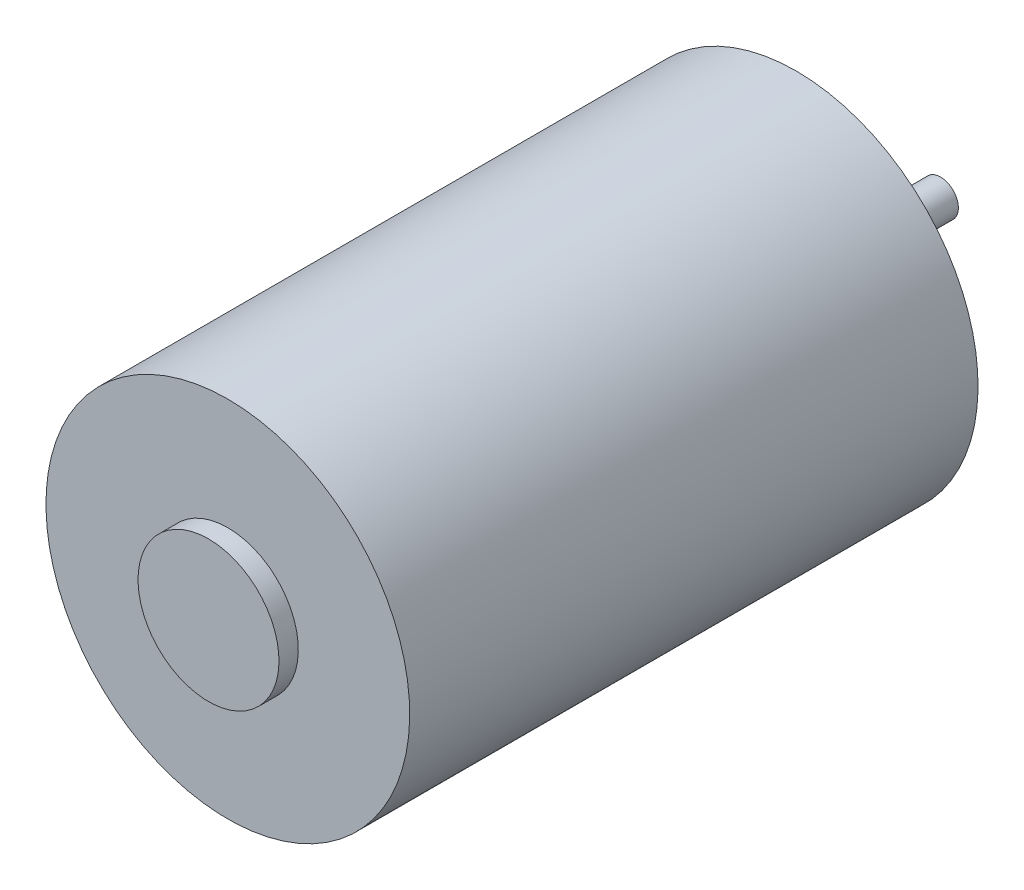
ISO-10303-21;
HEADER;
FILE_DESCRIPTION(('STEP AP214'),'2;1');
FILE_NAME('part.step','',(''),(''),'','','');
FILE_SCHEMA(('AUTOMOTIVE_DESIGN { 1 0 10303 214 1 1 1 1 }'));
ENDSEC;
DATA;
#1=APPLICATION_CONTEXT('core data for automotive mechanical design processes');
#2=APPLICATION_PROTOCOL_DEFINITION('international standard','automotive_design',2000,#1);
#3=PRODUCT_CONTEXT('',#1,'mechanical');
#4=PRODUCT('Part','Part','',(#3));
#5=PRODUCT_RELATED_PRODUCT_CATEGORY('part','',(#4));
#6=PRODUCT_DEFINITION_FORMATION('','',#4);
#7=PRODUCT_DEFINITION_CONTEXT('part definition',#1,'design');
#8=PRODUCT_DEFINITION('design','',#6,#7);
#9=PRODUCT_DEFINITION_SHAPE('','',#8);
#10=(LENGTH_UNIT() NAMED_UNIT(*) SI_UNIT(.MILLI.,.METRE.));
#11=(NAMED_UNIT(*) PLANE_ANGLE_UNIT() SI_UNIT($,.RADIAN.));
#12=(NAMED_UNIT(*) SI_UNIT($,.STERADIAN.) SOLID_ANGLE_UNIT());
#13=UNCERTAINTY_MEASURE_WITH_UNIT(LENGTH_MEASURE(1.E-05),#10,'distance_accuracy_value','');
#14=(GEOMETRIC_REPRESENTATION_CONTEXT(3) GLOBAL_UNCERTAINTY_ASSIGNED_CONTEXT((#13)) GLOBAL_UNIT_ASSIGNED_CONTEXT((#10,
#11,#12)) REPRESENTATION_CONTEXT('',''));
#15=CARTESIAN_POINT('',(0.,0.,0.));
#16=DIRECTION('',(0.,0.,1.));
#17=DIRECTION('',(1.,0.,0.));
#18=AXIS2_PLACEMENT_3D('',#15,#16,#17);
#19=CARTESIAN_POINT('',(0.,0.,0.));
#20=DIRECTION('',(0.,0.,-1.));
#21=DIRECTION('',(0.,1.,0.));
#22=AXIS2_PLACEMENT_3D('',#19,#20,#21);
#23=PLANE('',#22);
#24=CARTESIAN_POINT('',(0.,0.,0.));
#25=DIRECTION('',(0.,0.,-1.));
#26=DIRECTION('',(0.,1.,0.));
#27=AXIS2_PLACEMENT_3D('',#24,#25,#26);
#28=CIRCLE('',#27,6.20000000000001);
#29=CARTESIAN_POINT('',(0.,6.20000000000001,0.));
#30=VERTEX_POINT('',#29);
#31=EDGE_CURVE('E10',#30,#30,#28,.T.);
#32=ORIENTED_EDGE('',*,*,#31,.F.);
#33=EDGE_LOOP('',(#32));
#34=FACE_BOUND('',#33,.T.);
#35=ADVANCED_FACE('F29',(#34),#23,.F.);
#36=CARTESIAN_POINT('',(0.,0.,-64.4));
#37=DIRECTION('',(0.,0.,-1.));
#38=DIRECTION('',(0.,1.,0.));
#39=AXIS2_PLACEMENT_3D('',#36,#37,#38);
#40=CYLINDRICAL_SURFACE('',#39,6.2);
#41=CARTESIAN_POINT('',(0.,0.,-1.70000000000001));
#42=DIRECTION('',(0.,0.,-1.));
#43=DIRECTION('',(0.,1.,0.));
#44=AXIS2_PLACEMENT_3D('',#41,#42,#43);
#45=CIRCLE('',#44,6.2);
#46=CARTESIAN_POINT('',(0.,6.2,-1.70000000000001));
#47=VERTEX_POINT('',#46);
#48=EDGE_CURVE('E35',#47,#47,#45,.T.);
#49=ORIENTED_EDGE('',*,*,#48,.F.);
#50=EDGE_LOOP('',(#49));
#51=FACE_BOUND('',#50,.T.);
#52=ORIENTED_EDGE('',*,*,#31,.T.);
#53=EDGE_LOOP('',(#52));
#54=FACE_BOUND('',#53,.T.);
#55=ADVANCED_FACE('F101',(#51,#54),#40,.T.);
#56=CARTESIAN_POINT('',(0.,-6.2,-1.7));
#57=DIRECTION('',(0.,0.,-1.));
#58=DIRECTION('',(0.,1.,0.));
#59=AXIS2_PLACEMENT_3D('',#56,#57,#58);
#60=PLANE('',#59);
#61=CARTESIAN_POINT('',(0.,0.,-1.70000000000001));
#62=DIRECTION('',(0.,0.,-1.));
#63=DIRECTION('',(0.,1.,0.));
#64=AXIS2_PLACEMENT_3D('',#61,#62,#63);
#65=CIRCLE('',#64,16.);
#66=CARTESIAN_POINT('',(0.,16.,-1.70000000000001));
#67=VERTEX_POINT('',#66);
#68=EDGE_CURVE('E39',#67,#67,#65,.T.);
#69=ORIENTED_EDGE('',*,*,#68,.F.);
#70=EDGE_LOOP('',(#69));
#71=FACE_BOUND('',#70,.T.);
#72=ORIENTED_EDGE('',*,*,#48,.T.);
#73=EDGE_LOOP('',(#72));
#74=FACE_BOUND('',#73,.T.);
#75=ADVANCED_FACE('F96',(#71,#74),#60,.F.);
#76=CARTESIAN_POINT('',(0.,0.,-64.4));
#77=DIRECTION('',(0.,0.,-1.));
#78=DIRECTION('',(0.,1.,0.));
#79=AXIS2_PLACEMENT_3D('',#76,#77,#78);
#80=CYLINDRICAL_SURFACE('',#79,16.);
#81=CARTESIAN_POINT('',(0.,0.,-51.7));
#82=DIRECTION('',(0.,0.,-1.));
#83=DIRECTION('',(0.,1.,0.));
#84=AXIS2_PLACEMENT_3D('',#81,#82,#83);
#85=CIRCLE('',#84,16.);
#86=CARTESIAN_POINT('',(0.,16.,-51.7));
#87=VERTEX_POINT('',#86);
#88=EDGE_CURVE('E43',#87,#87,#85,.T.);
#89=ORIENTED_EDGE('',*,*,#88,.F.);
#90=EDGE_LOOP('',(#89));
#91=FACE_BOUND('',#90,.T.);
#92=ORIENTED_EDGE('',*,*,#68,.T.);
#93=EDGE_LOOP('',(#92));
#94=FACE_BOUND('',#93,.T.);
#95=ADVANCED_FACE('F86',(#91,#94),#80,.T.);
#96=CARTESIAN_POINT('',(0.,-6.19999999999999,-51.7));
#97=DIRECTION('',(0.,0.,1.));
#98=DIRECTION('',(0.,-1.,0.));
#99=AXIS2_PLACEMENT_3D('',#96,#97,#98);
#100=PLANE('',#99);
#101=CARTESIAN_POINT('',(12.7,0.,-51.7));
#102=DIRECTION('',(0.,0.,-1.));
#103=DIRECTION('',(0.,1.,0.));
#104=AXIS2_PLACEMENT_3D('',#101,#102,#103);
#105=CIRCLE('',#104,2.);
#106=CARTESIAN_POINT('',(12.7,2.,-51.7));
#107=VERTEX_POINT('',#106);
#108=EDGE_CURVE('E67',#107,#107,#105,.T.);
#109=ORIENTED_EDGE('',*,*,#108,.F.);
#110=EDGE_LOOP('',(#109));
#111=FACE_BOUND('',#110,.T.);
#112=CARTESIAN_POINT('',(-12.7,0.,-51.7));
#113=DIRECTION('',(0.,0.,-1.));
#114=DIRECTION('',(0.,1.,0.));
#115=AXIS2_PLACEMENT_3D('',#112,#113,#114);
#116=CIRCLE('',#115,2.);
#117=CARTESIAN_POINT('',(-12.7,2.,-51.7));
#118=VERTEX_POINT('',#117);
#119=EDGE_CURVE('E61',#118,#118,#116,.T.);
#120=ORIENTED_EDGE('',*,*,#119,.F.);
#121=EDGE_LOOP('',(#120));
#122=FACE_BOUND('',#121,.T.);
#123=CARTESIAN_POINT('',(0.,0.,-51.7));
#124=DIRECTION('',(0.,0.,-1.));
#125=DIRECTION('',(0.,1.,0.));
#126=AXIS2_PLACEMENT_3D('',#123,#124,#125);
#127=CIRCLE('',#126,6.19999999999999);
#128=CARTESIAN_POINT('',(0.,6.19999999999999,-51.7));
#129=VERTEX_POINT('',#128);
#130=EDGE_CURVE('E48',#129,#129,#127,.T.);
#131=ORIENTED_EDGE('',*,*,#130,.F.);
#132=EDGE_LOOP('',(#131));
#133=FACE_BOUND('',#132,.T.);
#134=ORIENTED_EDGE('',*,*,#88,.T.);
#135=EDGE_LOOP('',(#134));
#136=FACE_BOUND('',#135,.T.);
#137=ADVANCED_FACE('F82',(#111,#122,#133,#136),#100,.F.);
#138=CARTESIAN_POINT('',(0.,0.,-64.4));
#139=DIRECTION('',(0.,0.,-1.));
#140=DIRECTION('',(0.,1.,0.));
#141=AXIS2_PLACEMENT_3D('',#138,#139,#140);
#142=CYLINDRICAL_SURFACE('',#141,6.19999999999999);
#143=CARTESIAN_POINT('',(0.,0.,-53.4));
#144=DIRECTION('',(0.,0.,-1.));
#145=DIRECTION('',(0.,1.,0.));
#146=AXIS2_PLACEMENT_3D('',#143,#144,#145);
#147=CIRCLE('',#146,6.19999999999999);
#148=CARTESIAN_POINT('',(0.,6.19999999999999,-53.4));
#149=VERTEX_POINT('',#148);
#150=EDGE_CURVE('E51',#149,#149,#147,.T.);
#151=ORIENTED_EDGE('',*,*,#150,.F.);
#152=EDGE_LOOP('',(#151));
#153=FACE_BOUND('',#152,.T.);
#154=ORIENTED_EDGE('',*,*,#130,.T.);
#155=EDGE_LOOP('',(#154));
#156=FACE_BOUND('',#155,.T.);
#157=ADVANCED_FACE('F85',(#153,#156),#142,.T.);
#158=CARTESIAN_POINT('',(0.,-1.57,-53.4));
#159=DIRECTION('',(0.,0.,1.));
#160=DIRECTION('',(0.,-1.,0.));
#161=AXIS2_PLACEMENT_3D('',#158,#159,#160);
#162=PLANE('',#161);
#163=CARTESIAN_POINT('',(0.,0.,-53.4));
#164=DIRECTION('',(0.,0.,-1.));
#165=DIRECTION('',(0.,1.,0.));
#166=AXIS2_PLACEMENT_3D('',#163,#164,#165);
#167=CIRCLE('',#166,1.57);
#168=CARTESIAN_POINT('',(0.,1.57,-53.4));
#169=VERTEX_POINT('',#168);
#170=EDGE_CURVE('E54',#169,#169,#167,.T.);
#171=ORIENTED_EDGE('',*,*,#170,.F.);
#172=EDGE_LOOP('',(#171));
#173=FACE_BOUND('',#172,.T.);
#174=ORIENTED_EDGE('',*,*,#150,.T.);
#175=EDGE_LOOP('',(#174));
#176=FACE_BOUND('',#175,.T.);
#177=ADVANCED_FACE('F136',(#173,#176),#162,.F.);
#178=CARTESIAN_POINT('',(0.,0.,-64.4));
#179=DIRECTION('',(0.,0.,-1.));
#180=DIRECTION('',(0.,1.,0.));
#181=AXIS2_PLACEMENT_3D('',#178,#179,#180);
#182=CYLINDRICAL_SURFACE('',#181,1.57);
#183=CARTESIAN_POINT('',(0.,0.,-64.4));
#184=DIRECTION('',(0.,0.,-1.));
#185=DIRECTION('',(0.,1.,0.));
#186=AXIS2_PLACEMENT_3D('',#183,#184,#185);
#187=CIRCLE('',#186,1.57);
#188=CARTESIAN_POINT('',(0.,1.57,-64.4));
#189=VERTEX_POINT('',#188);
#190=EDGE_CURVE('E57',#189,#189,#187,.T.);
#191=ORIENTED_EDGE('',*,*,#190,.F.);
#192=EDGE_LOOP('',(#191));
#193=FACE_BOUND('',#192,.T.);
#194=ORIENTED_EDGE('',*,*,#170,.T.);
#195=EDGE_LOOP('',(#194));
#196=FACE_BOUND('',#195,.T.);
#197=ADVANCED_FACE('F146',(#193,#196),#182,.T.);
#198=CARTESIAN_POINT('',(0.,-1.57,-64.4));
#199=DIRECTION('',(0.,0.,1.));
#200=DIRECTION('',(0.,-1.,0.));
#201=AXIS2_PLACEMENT_3D('',#198,#199,#200);
#202=PLANE('',#201);
#203=ORIENTED_EDGE('',*,*,#190,.T.);
#204=EDGE_LOOP('',(#203));
#205=FACE_BOUND('',#204,.T.);
#206=ADVANCED_FACE('F156',(#205),#202,.F.);
#207=CARTESIAN_POINT('',(-12.7,0.,-41.7));
#208=DIRECTION('',(0.,0.,-1.));
#209=DIRECTION('',(0.,1.,0.));
#210=AXIS2_PLACEMENT_3D('',#207,#208,#209);
#211=CYLINDRICAL_SURFACE('',#210,2.);
#212=CARTESIAN_POINT('',(-12.7,0.,-41.7));
#213=DIRECTION('',(0.,0.,-1.));
#214=DIRECTION('',(0.,1.,0.));
#215=AXIS2_PLACEMENT_3D('',#212,#213,#214);
#216=CIRCLE('',#215,2.);
#217=CARTESIAN_POINT('',(-12.7,2.,-41.7));
#218=VERTEX_POINT('',#217);
#219=EDGE_CURVE('E60',#218,#218,#216,.T.);
#220=ORIENTED_EDGE('',*,*,#219,.F.);
#221=EDGE_LOOP('',(#220));
#222=FACE_BOUND('',#221,.T.);
#223=ORIENTED_EDGE('',*,*,#119,.T.);
#224=EDGE_LOOP('',(#223));
#225=FACE_BOUND('',#224,.T.);
#226=ADVANCED_FACE('F165',(#222,#225),#211,.F.);
#227=CARTESIAN_POINT('',(-12.7,0.,-41.7));
#228=DIRECTION('',(0.,0.,-1.));
#229=DIRECTION('',(0.,1.,0.));
#230=AXIS2_PLACEMENT_3D('',#227,#228,#229);
#231=PLANE('',#230);
#232=ORIENTED_EDGE('',*,*,#219,.T.);
#233=EDGE_LOOP('',(#232));
#234=FACE_BOUND('',#233,.T.);
#235=ADVANCED_FACE('F78',(#234),#231,.T.);
#236=CARTESIAN_POINT('',(12.7,0.,-41.7));
#237=DIRECTION('',(0.,0.,-1.));
#238=DIRECTION('',(0.,1.,0.));
#239=AXIS2_PLACEMENT_3D('',#236,#237,#238);
#240=CYLINDRICAL_SURFACE('',#239,2.);
#241=CARTESIAN_POINT('',(12.7,0.,-41.7));
#242=DIRECTION('',(0.,0.,-1.));
#243=DIRECTION('',(0.,1.,0.));
#244=AXIS2_PLACEMENT_3D('',#241,#242,#243);
#245=CIRCLE('',#244,2.);
#246=CARTESIAN_POINT('',(12.7,2.,-41.7));
#247=VERTEX_POINT('',#246);
#248=EDGE_CURVE('E64',#247,#247,#245,.T.);
#249=ORIENTED_EDGE('',*,*,#248,.F.);
#250=EDGE_LOOP('',(#249));
#251=FACE_BOUND('',#250,.T.);
#252=ORIENTED_EDGE('',*,*,#108,.T.);
#253=EDGE_LOOP('',(#252));
#254=FACE_BOUND('',#253,.T.);
#255=ADVANCED_FACE('F75',(#251,#254),#240,.F.);
#256=CARTESIAN_POINT('',(12.7,0.,-41.7));
#257=DIRECTION('',(0.,0.,-1.));
#258=DIRECTION('',(0.,1.,0.));
#259=AXIS2_PLACEMENT_3D('',#256,#257,#258);
#260=PLANE('',#259);
#261=ORIENTED_EDGE('',*,*,#248,.T.);
#262=EDGE_LOOP('',(#261));
#263=FACE_BOUND('',#262,.T.);
#264=ADVANCED_FACE('F73',(#263),#260,.T.);
#265=CLOSED_SHELL('',(#35,#55,#75,#95,#137,#157,#177,#197,#206,#226,#235,#255,#264));
#266=MANIFOLD_SOLID_BREP('B2',#265);
#267=ADVANCED_BREP_SHAPE_REPRESENTATION('',(#18,#266),#14);
#268=SHAPE_DEFINITION_REPRESENTATION(#9,#267);
ENDSEC;
END-ISO-10303-21;
